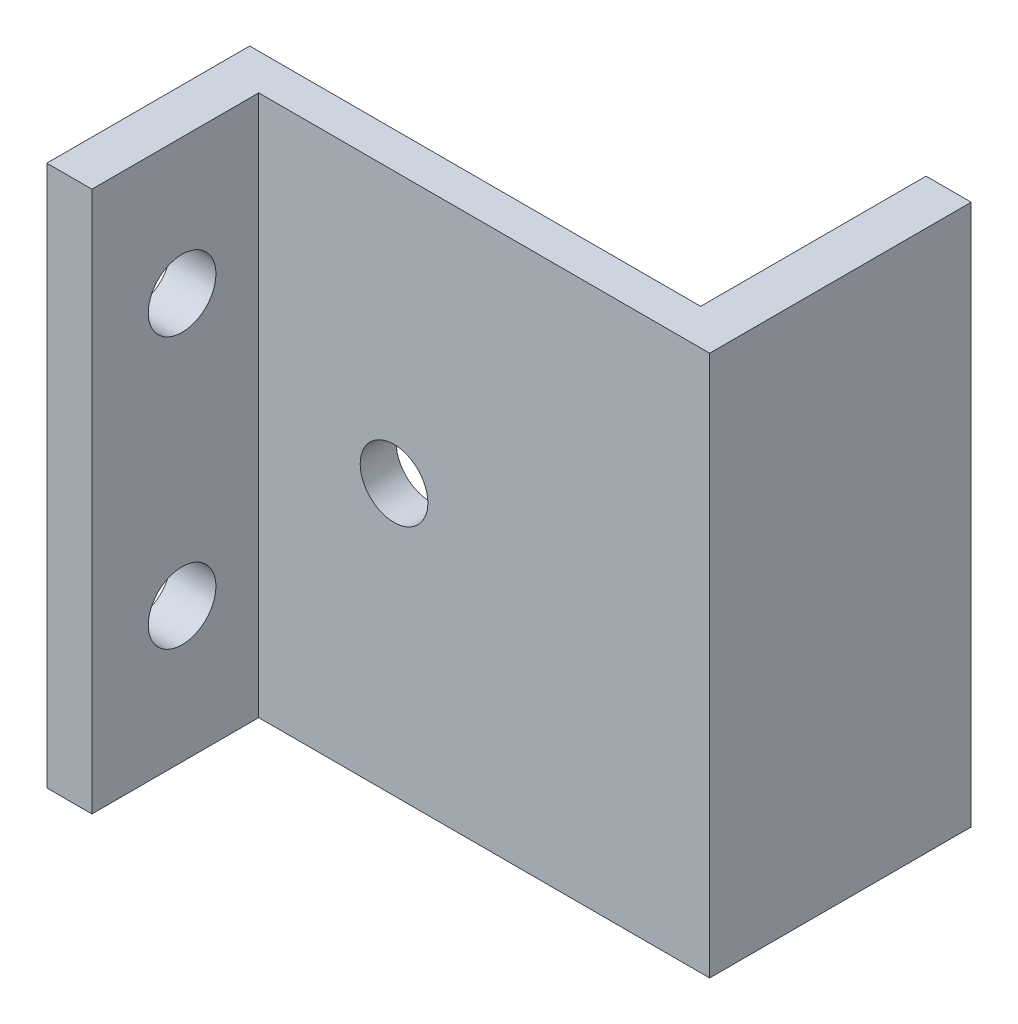
ISO-10303-21;
HEADER;
FILE_DESCRIPTION(('STEP AP214'),'2;1');
FILE_NAME('part.step','',(''),(''),'','','');
FILE_SCHEMA(('AUTOMOTIVE_DESIGN { 1 0 10303 214 1 1 1 1 }'));
ENDSEC;
DATA;
#1=APPLICATION_CONTEXT('core data for automotive mechanical design processes');
#2=APPLICATION_PROTOCOL_DEFINITION('international standard','automotive_design',2000,#1);
#3=PRODUCT_CONTEXT('',#1,'mechanical');
#4=PRODUCT('Part','Part','',(#3));
#5=PRODUCT_RELATED_PRODUCT_CATEGORY('part','',(#4));
#6=PRODUCT_DEFINITION_FORMATION('','',#4);
#7=PRODUCT_DEFINITION_CONTEXT('part definition',#1,'design');
#8=PRODUCT_DEFINITION('design','',#6,#7);
#9=PRODUCT_DEFINITION_SHAPE('','',#8);
#10=(LENGTH_UNIT() NAMED_UNIT(*) SI_UNIT(.MILLI.,.METRE.));
#11=(NAMED_UNIT(*) PLANE_ANGLE_UNIT() SI_UNIT($,.RADIAN.));
#12=(NAMED_UNIT(*) SI_UNIT($,.STERADIAN.) SOLID_ANGLE_UNIT());
#13=UNCERTAINTY_MEASURE_WITH_UNIT(LENGTH_MEASURE(1.E-05),#10,'distance_accuracy_value','');
#14=(GEOMETRIC_REPRESENTATION_CONTEXT(3) GLOBAL_UNCERTAINTY_ASSIGNED_CONTEXT((#13)) GLOBAL_UNIT_ASSIGNED_CONTEXT((#10,
#11,#12)) REPRESENTATION_CONTEXT('',''));
#15=CARTESIAN_POINT('',(0.,0.,0.));
#16=DIRECTION('',(0.,0.,1.));
#17=DIRECTION('',(1.,0.,0.));
#18=AXIS2_PLACEMENT_3D('',#15,#16,#17);
#19=CARTESIAN_POINT('',(0.,24.,0.));
#20=DIRECTION('',(1.,0.,0.));
#21=DIRECTION('',(0.,0.,-1.));
#22=AXIS2_PLACEMENT_3D('',#19,#20,#21);
#23=PLANE('',#22);
#24=CARTESIAN_POINT('',(0.,6.,3.4));
#25=DIRECTION('',(-1.,0.,0.));
#26=DIRECTION('',(0.,0.,1.));
#27=AXIS2_PLACEMENT_3D('',#24,#25,#26);
#28=CIRCLE('',#27,1.5);
#29=CARTESIAN_POINT('',(0.,6.,4.9));
#30=VERTEX_POINT('',#29);
#31=EDGE_CURVE('E165',#30,#30,#28,.T.);
#32=ORIENTED_EDGE('',*,*,#31,.F.);
#33=EDGE_LOOP('',(#32));
#34=FACE_BOUND('',#33,.T.);
#35=CARTESIAN_POINT('',(0.,18.,3.4));
#36=DIRECTION('',(-1.,0.,0.));
#37=DIRECTION('',(0.,0.,1.));
#38=AXIS2_PLACEMENT_3D('',#35,#36,#37);
#39=CIRCLE('',#38,1.5);
#40=CARTESIAN_POINT('',(0.,18.,4.9));
#41=VERTEX_POINT('',#40);
#42=EDGE_CURVE('E157',#41,#41,#39,.T.);
#43=ORIENTED_EDGE('',*,*,#42,.F.);
#44=EDGE_LOOP('',(#43));
#45=FACE_BOUND('',#44,.T.);
#46=DIRECTION('',(0.,0.,1.));
#47=VECTOR('',#46,1.);
#48=CARTESIAN_POINT('',(0.,0.,0.));
#49=LINE('',#48,#47);
#50=CARTESIAN_POINT('',(0.,0.,-1.6));
#51=VERTEX_POINT('',#50);
#52=CARTESIAN_POINT('',(0.,0.,7.4));
#53=VERTEX_POINT('',#52);
#54=EDGE_CURVE('E87',#51,#53,#49,.T.);
#55=ORIENTED_EDGE('',*,*,#54,.T.);
#56=DIRECTION('',(0.,-1.,0.));
#57=VECTOR('',#56,1.);
#58=CARTESIAN_POINT('',(0.,24.,7.4));
#59=LINE('',#58,#57);
#60=CARTESIAN_POINT('',(0.,24.,7.4));
#61=VERTEX_POINT('',#60);
#62=EDGE_CURVE('E11',#61,#53,#59,.T.);
#63=ORIENTED_EDGE('',*,*,#62,.F.);
#64=DIRECTION('',(0.,0.,1.));
#65=VECTOR('',#64,1.);
#66=CARTESIAN_POINT('',(0.,24.,-1.6));
#67=LINE('',#66,#65);
#68=CARTESIAN_POINT('',(0.,24.,-1.6));
#69=VERTEX_POINT('',#68);
#70=EDGE_CURVE('E93',#69,#61,#67,.T.);
#71=ORIENTED_EDGE('',*,*,#70,.F.);
#72=DIRECTION('',(0.,-1.,0.));
#73=VECTOR('',#72,1.);
#74=CARTESIAN_POINT('',(0.,24.,-1.6));
#75=LINE('',#74,#73);
#76=EDGE_CURVE('E127',#69,#51,#75,.T.);
#77=ORIENTED_EDGE('',*,*,#76,.T.);
#78=EDGE_LOOP('',(#55,#63,#71,#77));
#79=FACE_BOUND('',#78,.T.);
#80=ADVANCED_FACE('F33',(#34,#45,#79),#23,.F.);
#81=CARTESIAN_POINT('',(0.,24.,7.4));
#82=DIRECTION('',(0.,0.,-1.));
#83=DIRECTION('',(-1.,0.,0.));
#84=AXIS2_PLACEMENT_3D('',#81,#82,#83);
#85=PLANE('',#84);
#86=DIRECTION('',(1.,0.,0.));
#87=VECTOR('',#86,1.);
#88=CARTESIAN_POINT('',(0.,0.,7.4));
#89=LINE('',#88,#87);
#90=CARTESIAN_POINT('',(2.,0.,7.4));
#91=VERTEX_POINT('',#90);
#92=EDGE_CURVE('E132',#53,#91,#89,.T.);
#93=ORIENTED_EDGE('',*,*,#92,.T.);
#94=DIRECTION('',(0.,-1.,0.));
#95=VECTOR('',#94,1.);
#96=CARTESIAN_POINT('',(2.,24.,7.4));
#97=LINE('',#96,#95);
#98=CARTESIAN_POINT('',(2.,24.,7.4));
#99=VERTEX_POINT('',#98);
#100=EDGE_CURVE('E42',#99,#91,#97,.T.);
#101=ORIENTED_EDGE('',*,*,#100,.F.);
#102=DIRECTION('',(1.,0.,0.));
#103=VECTOR('',#102,1.);
#104=CARTESIAN_POINT('',(0.,24.,7.4));
#105=LINE('',#104,#103);
#106=EDGE_CURVE('E170',#61,#99,#105,.T.);
#107=ORIENTED_EDGE('',*,*,#106,.F.);
#108=ORIENTED_EDGE('',*,*,#62,.T.);
#109=EDGE_LOOP('',(#93,#101,#107,#108));
#110=FACE_BOUND('',#109,.T.);
#111=ADVANCED_FACE('F192',(#110),#85,.F.);
#112=CARTESIAN_POINT('',(2.,24.,7.4));
#113=DIRECTION('',(-1.,0.,0.));
#114=DIRECTION('',(0.,0.,1.));
#115=AXIS2_PLACEMENT_3D('',#112,#113,#114);
#116=PLANE('',#115);
#117=CARTESIAN_POINT('',(2.,6.,3.4));
#118=DIRECTION('',(-1.,0.,0.));
#119=DIRECTION('',(0.,0.,1.));
#120=AXIS2_PLACEMENT_3D('',#117,#118,#119);
#121=CIRCLE('',#120,1.5);
#122=CARTESIAN_POINT('',(2.,6.,4.9));
#123=VERTEX_POINT('',#122);
#124=EDGE_CURVE('E36',#123,#123,#121,.T.);
#125=ORIENTED_EDGE('',*,*,#124,.T.);
#126=EDGE_LOOP('',(#125));
#127=FACE_BOUND('',#126,.T.);
#128=CARTESIAN_POINT('',(2.,18.,3.4));
#129=DIRECTION('',(-1.,0.,0.));
#130=DIRECTION('',(0.,0.,1.));
#131=AXIS2_PLACEMENT_3D('',#128,#129,#130);
#132=CIRCLE('',#131,1.5);
#133=CARTESIAN_POINT('',(2.,18.,4.9));
#134=VERTEX_POINT('',#133);
#135=EDGE_CURVE('E133',#134,#134,#132,.T.);
#136=ORIENTED_EDGE('',*,*,#135,.T.);
#137=EDGE_LOOP('',(#136));
#138=FACE_BOUND('',#137,.T.);
#139=DIRECTION('',(0.,0.,-1.));
#140=VECTOR('',#139,1.);
#141=CARTESIAN_POINT('',(2.,0.,7.4));
#142=LINE('',#141,#140);
#143=CARTESIAN_POINT('',(2.,0.,0.));
#144=VERTEX_POINT('',#143);
#145=EDGE_CURVE('E135',#91,#144,#142,.T.);
#146=ORIENTED_EDGE('',*,*,#145,.T.);
#147=DIRECTION('',(0.,-1.,0.));
#148=VECTOR('',#147,1.);
#149=CARTESIAN_POINT('',(2.,24.,0.));
#150=LINE('',#149,#148);
#151=CARTESIAN_POINT('',(2.,24.,0.));
#152=VERTEX_POINT('',#151);
#153=EDGE_CURVE('E152',#152,#144,#150,.T.);
#154=ORIENTED_EDGE('',*,*,#153,.F.);
#155=DIRECTION('',(0.,0.,-1.));
#156=VECTOR('',#155,1.);
#157=CARTESIAN_POINT('',(2.,24.,7.4));
#158=LINE('',#157,#156);
#159=EDGE_CURVE('E172',#99,#152,#158,.T.);
#160=ORIENTED_EDGE('',*,*,#159,.F.);
#161=ORIENTED_EDGE('',*,*,#100,.T.);
#162=EDGE_LOOP('',(#146,#154,#160,#161));
#163=FACE_BOUND('',#162,.T.);
#164=ADVANCED_FACE('F195',(#127,#138,#163),#116,.F.);
#165=CARTESIAN_POINT('',(2.,24.,0.));
#166=DIRECTION('',(0.,0.,-1.));
#167=DIRECTION('',(-1.,0.,0.));
#168=AXIS2_PLACEMENT_3D('',#165,#166,#167);
#169=PLANE('',#168);
#170=CARTESIAN_POINT('',(8.,12.,0.));
#171=DIRECTION('',(0.,0.,-1.));
#172=DIRECTION('',(-1.,0.,0.));
#173=AXIS2_PLACEMENT_3D('',#170,#171,#172);
#174=CIRCLE('',#173,1.5);
#175=CARTESIAN_POINT('',(6.5,12.,0.));
#176=VERTEX_POINT('',#175);
#177=EDGE_CURVE('E213',#176,#176,#174,.T.);
#178=ORIENTED_EDGE('',*,*,#177,.T.);
#179=EDGE_LOOP('',(#178));
#180=FACE_BOUND('',#179,.T.);
#181=DIRECTION('',(1.,0.,0.));
#182=VECTOR('',#181,1.);
#183=CARTESIAN_POINT('',(2.,0.,0.));
#184=LINE('',#183,#182);
#185=CARTESIAN_POINT('',(22.,0.,0.));
#186=VERTEX_POINT('',#185);
#187=EDGE_CURVE('E137',#144,#186,#184,.T.);
#188=ORIENTED_EDGE('',*,*,#187,.T.);
#189=DIRECTION('',(0.,-1.,0.));
#190=VECTOR('',#189,1.);
#191=CARTESIAN_POINT('',(22.,24.,0.));
#192=LINE('',#191,#190);
#193=CARTESIAN_POINT('',(22.,24.,0.));
#194=VERTEX_POINT('',#193);
#195=EDGE_CURVE('E149',#194,#186,#192,.T.);
#196=ORIENTED_EDGE('',*,*,#195,.F.);
#197=DIRECTION('',(1.,0.,0.));
#198=VECTOR('',#197,1.);
#199=CARTESIAN_POINT('',(2.,24.,0.));
#200=LINE('',#199,#198);
#201=EDGE_CURVE('E174',#152,#194,#200,.T.);
#202=ORIENTED_EDGE('',*,*,#201,.F.);
#203=ORIENTED_EDGE('',*,*,#153,.T.);
#204=EDGE_LOOP('',(#188,#196,#202,#203));
#205=FACE_BOUND('',#204,.T.);
#206=ADVANCED_FACE('F180',(#180,#205),#169,.F.);
#207=CARTESIAN_POINT('',(22.,24.,0.));
#208=DIRECTION('',(-1.,0.,0.));
#209=DIRECTION('',(0.,0.,1.));
#210=AXIS2_PLACEMENT_3D('',#207,#208,#209);
#211=PLANE('',#210);
#212=DIRECTION('',(0.,0.,-1.));
#213=VECTOR('',#212,1.);
#214=CARTESIAN_POINT('',(22.,0.,0.));
#215=LINE('',#214,#213);
#216=CARTESIAN_POINT('',(22.,0.,-11.6));
#217=VERTEX_POINT('',#216);
#218=EDGE_CURVE('E139',#186,#217,#215,.T.);
#219=ORIENTED_EDGE('',*,*,#218,.T.);
#220=DIRECTION('',(0.,-1.,0.));
#221=VECTOR('',#220,1.);
#222=CARTESIAN_POINT('',(22.,24.,-11.6));
#223=LINE('',#222,#221);
#224=CARTESIAN_POINT('',(22.,24.,-11.6));
#225=VERTEX_POINT('',#224);
#226=EDGE_CURVE('E122',#225,#217,#223,.T.);
#227=ORIENTED_EDGE('',*,*,#226,.F.);
#228=DIRECTION('',(0.,0.,-1.));
#229=VECTOR('',#228,1.);
#230=CARTESIAN_POINT('',(22.,24.,0.));
#231=LINE('',#230,#229);
#232=EDGE_CURVE('E113',#194,#225,#231,.T.);
#233=ORIENTED_EDGE('',*,*,#232,.F.);
#234=ORIENTED_EDGE('',*,*,#195,.T.);
#235=EDGE_LOOP('',(#219,#227,#233,#234));
#236=FACE_BOUND('',#235,.T.);
#237=ADVANCED_FACE('F184',(#236),#211,.F.);
#238=CARTESIAN_POINT('',(22.,24.,-11.6));
#239=DIRECTION('',(0.,0.,1.));
#240=DIRECTION('',(1.,0.,0.));
#241=AXIS2_PLACEMENT_3D('',#238,#239,#240);
#242=PLANE('',#241);
#243=DIRECTION('',(-1.,0.,0.));
#244=VECTOR('',#243,1.);
#245=CARTESIAN_POINT('',(22.,0.,-11.6));
#246=LINE('',#245,#244);
#247=CARTESIAN_POINT('',(20.,0.,-11.6));
#248=VERTEX_POINT('',#247);
#249=EDGE_CURVE('E121',#217,#248,#246,.T.);
#250=ORIENTED_EDGE('',*,*,#249,.T.);
#251=DIRECTION('',(0.,-1.,0.));
#252=VECTOR('',#251,1.);
#253=CARTESIAN_POINT('',(20.,24.,-11.6));
#254=LINE('',#253,#252);
#255=CARTESIAN_POINT('',(20.,24.,-11.6));
#256=VERTEX_POINT('',#255);
#257=EDGE_CURVE('E118',#256,#248,#254,.T.);
#258=ORIENTED_EDGE('',*,*,#257,.F.);
#259=DIRECTION('',(-1.,0.,0.));
#260=VECTOR('',#259,1.);
#261=CARTESIAN_POINT('',(22.,24.,-11.6));
#262=LINE('',#261,#260);
#263=EDGE_CURVE('E107',#225,#256,#262,.T.);
#264=ORIENTED_EDGE('',*,*,#263,.F.);
#265=ORIENTED_EDGE('',*,*,#226,.T.);
#266=EDGE_LOOP('',(#250,#258,#264,#265));
#267=FACE_BOUND('',#266,.T.);
#268=ADVANCED_FACE('F119',(#267),#242,.F.);
#269=CARTESIAN_POINT('',(20.,24.,-11.6));
#270=DIRECTION('',(1.,0.,0.));
#271=DIRECTION('',(0.,0.,-1.));
#272=AXIS2_PLACEMENT_3D('',#269,#270,#271);
#273=PLANE('',#272);
#274=DIRECTION('',(0.,0.,1.));
#275=VECTOR('',#274,1.);
#276=CARTESIAN_POINT('',(20.,0.,-11.6));
#277=LINE('',#276,#275);
#278=CARTESIAN_POINT('',(20.,0.,-1.6));
#279=VERTEX_POINT('',#278);
#280=EDGE_CURVE('E80',#248,#279,#277,.T.);
#281=ORIENTED_EDGE('',*,*,#280,.T.);
#282=DIRECTION('',(0.,-1.,0.));
#283=VECTOR('',#282,1.);
#284=CARTESIAN_POINT('',(20.,24.,-1.6));
#285=LINE('',#284,#283);
#286=CARTESIAN_POINT('',(20.,24.,-1.6));
#287=VERTEX_POINT('',#286);
#288=EDGE_CURVE('E123',#287,#279,#285,.T.);
#289=ORIENTED_EDGE('',*,*,#288,.F.);
#290=DIRECTION('',(0.,0.,1.));
#291=VECTOR('',#290,1.);
#292=CARTESIAN_POINT('',(20.,24.,-11.6));
#293=LINE('',#292,#291);
#294=EDGE_CURVE('E111',#256,#287,#293,.T.);
#295=ORIENTED_EDGE('',*,*,#294,.F.);
#296=ORIENTED_EDGE('',*,*,#257,.T.);
#297=EDGE_LOOP('',(#281,#289,#295,#296));
#298=FACE_BOUND('',#297,.T.);
#299=ADVANCED_FACE('F125',(#298),#273,.F.);
#300=CARTESIAN_POINT('',(20.,24.,-1.6));
#301=DIRECTION('',(0.,0.,1.));
#302=DIRECTION('',(1.,0.,0.));
#303=AXIS2_PLACEMENT_3D('',#300,#301,#302);
#304=PLANE('',#303);
#305=CARTESIAN_POINT('',(8.,12.,-1.6));
#306=DIRECTION('',(0.,0.,-1.));
#307=DIRECTION('',(-1.,0.,0.));
#308=AXIS2_PLACEMENT_3D('',#305,#306,#307);
#309=CIRCLE('',#308,1.5);
#310=CARTESIAN_POINT('',(6.5,12.,-1.6));
#311=VERTEX_POINT('',#310);
#312=EDGE_CURVE('E215',#311,#311,#309,.T.);
#313=ORIENTED_EDGE('',*,*,#312,.F.);
#314=EDGE_LOOP('',(#313));
#315=FACE_BOUND('',#314,.T.);
#316=DIRECTION('',(-1.,0.,0.));
#317=VECTOR('',#316,1.);
#318=CARTESIAN_POINT('',(20.,0.,-1.6));
#319=LINE('',#318,#317);
#320=EDGE_CURVE('E143',#279,#51,#319,.T.);
#321=ORIENTED_EDGE('',*,*,#320,.T.);
#322=ORIENTED_EDGE('',*,*,#76,.F.);
#323=DIRECTION('',(-1.,0.,0.));
#324=VECTOR('',#323,1.);
#325=CARTESIAN_POINT('',(20.,24.,-1.6));
#326=LINE('',#325,#324);
#327=EDGE_CURVE('E51',#287,#69,#326,.T.);
#328=ORIENTED_EDGE('',*,*,#327,.F.);
#329=ORIENTED_EDGE('',*,*,#288,.T.);
#330=EDGE_LOOP('',(#321,#322,#328,#329));
#331=FACE_BOUND('',#330,.T.);
#332=ADVANCED_FACE('F187',(#315,#331),#304,.F.);
#333=CARTESIAN_POINT('',(0.,24.,0.));
#334=DIRECTION('',(0.,1.,0.));
#335=DIRECTION('',(0.,0.,1.));
#336=AXIS2_PLACEMENT_3D('',#333,#334,#335);
#337=PLANE('',#336);
#338=ORIENTED_EDGE('',*,*,#70,.T.);
#339=ORIENTED_EDGE('',*,*,#106,.T.);
#340=ORIENTED_EDGE('',*,*,#159,.T.);
#341=ORIENTED_EDGE('',*,*,#201,.T.);
#342=ORIENTED_EDGE('',*,*,#232,.T.);
#343=ORIENTED_EDGE('',*,*,#263,.T.);
#344=ORIENTED_EDGE('',*,*,#294,.T.);
#345=ORIENTED_EDGE('',*,*,#327,.T.);
#346=EDGE_LOOP('',(#338,#339,#340,#341,#342,#343,#344,#345));
#347=FACE_BOUND('',#346,.T.);
#348=ADVANCED_FACE('F109',(#347),#337,.T.);
#349=CARTESIAN_POINT('',(0.,0.,0.));
#350=DIRECTION('',(0.,1.,0.));
#351=DIRECTION('',(0.,0.,1.));
#352=AXIS2_PLACEMENT_3D('',#349,#350,#351);
#353=PLANE('',#352);
#354=ORIENTED_EDGE('',*,*,#54,.F.);
#355=ORIENTED_EDGE('',*,*,#320,.F.);
#356=ORIENTED_EDGE('',*,*,#280,.F.);
#357=ORIENTED_EDGE('',*,*,#249,.F.);
#358=ORIENTED_EDGE('',*,*,#218,.F.);
#359=ORIENTED_EDGE('',*,*,#187,.F.);
#360=ORIENTED_EDGE('',*,*,#145,.F.);
#361=ORIENTED_EDGE('',*,*,#92,.F.);
#362=EDGE_LOOP('',(#354,#355,#356,#357,#358,#359,#360,#361));
#363=FACE_BOUND('',#362,.T.);
#364=ADVANCED_FACE('F185',(#363),#353,.F.);
#365=CARTESIAN_POINT('',(24.,18.,3.4));
#366=DIRECTION('',(-1.,0.,0.));
#367=DIRECTION('',(0.,0.,1.));
#368=AXIS2_PLACEMENT_3D('',#365,#366,#367);
#369=CYLINDRICAL_SURFACE('',#368,1.5);
#370=ORIENTED_EDGE('',*,*,#42,.T.);
#371=EDGE_LOOP('',(#370));
#372=FACE_BOUND('',#371,.T.);
#373=ORIENTED_EDGE('',*,*,#135,.F.);
#374=EDGE_LOOP('',(#373));
#375=FACE_BOUND('',#374,.T.);
#376=ADVANCED_FACE('F265',(#372,#375),#369,.F.);
#377=CARTESIAN_POINT('',(24.,6.,3.4));
#378=DIRECTION('',(-1.,0.,0.));
#379=DIRECTION('',(0.,0.,1.));
#380=AXIS2_PLACEMENT_3D('',#377,#378,#379);
#381=CYLINDRICAL_SURFACE('',#380,1.5);
#382=ORIENTED_EDGE('',*,*,#31,.T.);
#383=EDGE_LOOP('',(#382));
#384=FACE_BOUND('',#383,.T.);
#385=ORIENTED_EDGE('',*,*,#124,.F.);
#386=EDGE_LOOP('',(#385));
#387=FACE_BOUND('',#386,.T.);
#388=ADVANCED_FACE('F285',(#384,#387),#381,.F.);
#389=CARTESIAN_POINT('',(8.,12.,11.4));
#390=DIRECTION('',(0.,0.,-1.));
#391=DIRECTION('',(-1.,0.,0.));
#392=AXIS2_PLACEMENT_3D('',#389,#390,#391);
#393=CYLINDRICAL_SURFACE('',#392,1.5);
#394=CARTESIAN_POINT('',(6.5,12.,-1.6));
#395=CARTESIAN_POINT('',(6.5,12.,-1.58333333333333));
#396=CARTESIAN_POINT('',(6.5,12.,-1.56666666666666));
#397=CARTESIAN_POINT('',(6.5,12.,-1.53333333333333));
#398=CARTESIAN_POINT('',(6.5,12.,-1.51666666666666));
#399=CARTESIAN_POINT('',(6.5,12.,-1.48333333333333));
#400=CARTESIAN_POINT('',(6.5,12.,-1.46666666666666));
#401=CARTESIAN_POINT('',(6.5,12.,-1.43333333333333));
#402=CARTESIAN_POINT('',(6.5,12.,-1.41666666666666));
#403=CARTESIAN_POINT('',(6.5,12.,-1.38333333333333));
#404=CARTESIAN_POINT('',(6.5,12.,-1.36666666666666));
#405=CARTESIAN_POINT('',(6.5,12.,-1.33333333333333));
#406=CARTESIAN_POINT('',(6.5,12.,-1.31666666666666));
#407=CARTESIAN_POINT('',(6.5,12.,-1.28333333333333));
#408=CARTESIAN_POINT('',(6.5,12.,-1.26666666666666));
#409=CARTESIAN_POINT('',(6.5,12.,-1.23333333333333));
#410=CARTESIAN_POINT('',(6.5,12.,-1.21666666666666));
#411=CARTESIAN_POINT('',(6.5,12.,-1.18333333333333));
#412=CARTESIAN_POINT('',(6.5,12.,-1.16666666666666));
#413=CARTESIAN_POINT('',(6.5,12.,-1.13333333333333));
#414=CARTESIAN_POINT('',(6.5,12.,-1.11666666666667));
#415=CARTESIAN_POINT('',(6.5,12.,-1.08333333333333));
#416=CARTESIAN_POINT('',(6.5,12.,-1.06666666666667));
#417=CARTESIAN_POINT('',(6.5,12.,-1.03333333333333));
#418=CARTESIAN_POINT('',(6.5,12.,-1.01666666666666));
#419=CARTESIAN_POINT('',(6.5,12.,-0.983333333333331));
#420=CARTESIAN_POINT('',(6.5,12.,-0.966666666666664));
#421=CARTESIAN_POINT('',(6.5,12.,-0.933333333333331));
#422=CARTESIAN_POINT('',(6.5,12.,-0.916666666666665));
#423=CARTESIAN_POINT('',(6.5,12.,-0.883333333333331));
#424=CARTESIAN_POINT('',(6.5,12.,-0.866666666666665));
#425=CARTESIAN_POINT('',(6.5,12.,-0.833333333333332));
#426=CARTESIAN_POINT('',(6.5,12.,-0.816666666666665));
#427=CARTESIAN_POINT('',(6.5,12.,-0.783333333333332));
#428=CARTESIAN_POINT('',(6.5,12.,-0.766666666666665));
#429=CARTESIAN_POINT('',(6.5,12.,-0.733333333333332));
#430=CARTESIAN_POINT('',(6.5,12.,-0.716666666666666));
#431=CARTESIAN_POINT('',(6.5,12.,-0.683333333333333));
#432=CARTESIAN_POINT('',(6.5,12.,-0.666666666666666));
#433=CARTESIAN_POINT('',(6.5,12.,-0.633333333333333));
#434=CARTESIAN_POINT('',(6.5,12.,-0.616666666666666));
#435=CARTESIAN_POINT('',(6.5,12.,-0.583333333333333));
#436=CARTESIAN_POINT('',(6.5,12.,-0.566666666666666));
#437=CARTESIAN_POINT('',(6.5,12.,-0.533333333333332));
#438=CARTESIAN_POINT('',(6.5,12.,-0.516666666666665));
#439=CARTESIAN_POINT('',(6.5,12.,-0.483333333333332));
#440=CARTESIAN_POINT('',(6.5,12.,-0.466666666666666));
#441=CARTESIAN_POINT('',(6.5,12.,-0.433333333333332));
#442=CARTESIAN_POINT('',(6.5,12.,-0.416666666666666));
#443=CARTESIAN_POINT('',(6.5,12.,-0.383333333333333));
#444=CARTESIAN_POINT('',(6.5,12.,-0.366666666666666));
#445=CARTESIAN_POINT('',(6.5,12.,-0.333333333333333));
#446=CARTESIAN_POINT('',(6.5,12.,-0.316666666666666));
#447=CARTESIAN_POINT('',(6.5,12.,-0.283333333333333));
#448=CARTESIAN_POINT('',(6.5,12.,-0.266666666666667));
#449=CARTESIAN_POINT('',(6.5,12.,-0.233333333333333));
#450=CARTESIAN_POINT('',(6.5,12.,-0.216666666666666));
#451=CARTESIAN_POINT('',(6.5,12.,-0.183333333333332));
#452=CARTESIAN_POINT('',(6.5,12.,-0.166666666666666));
#453=CARTESIAN_POINT('',(6.5,12.,-0.133333333333333));
#454=CARTESIAN_POINT('',(6.5,12.,-0.116666666666666));
#455=CARTESIAN_POINT('',(6.5,12.,-0.0833333333333328));
#456=CARTESIAN_POINT('',(6.5,12.,-0.0666666666666663));
#457=CARTESIAN_POINT('',(6.5,12.,-0.0333333333333331));
#458=CARTESIAN_POINT('',(6.5,12.,-0.0166666666666666));
#459=CARTESIAN_POINT('',(6.5,12.,0.));
#460=B_SPLINE_CURVE_WITH_KNOTS('',3,(#394,#395,#396,#397,#398,#399,#400,#401,#402,#403,#404,
#405,#406,#407,#408,#409,#410,#411,#412,#413,#414,#415,#416,#417,#418,#419,#420,#421,#422,#423,
#424,#425,#426,#427,#428,#429,#430,#431,#432,#433,#434,#435,#436,#437,#438,#439,#440,#441,#442,
#443,#444,#445,#446,#447,#448,#449,#450,#451,#452,#453,#454,#455,#456,#457,#458,#459),
.UNSPECIFIED.,.F.,.F.,(4,2,2,2,2,2,2,2,2,2,2,2,2,2,2,2,2,2,2,2,2,2,2,2,2,2,2,2,2,2,2,2,4),(0.,
0.0499999999999997,0.0999999999999994,0.149999999999999,0.199999999999999,0.25,0.3,0.35,
0.399999999999999,0.449999999999999,0.499999999999999,0.549999999999998,0.6,0.65,
0.699999999999999,0.749999999999999,0.799999999999999,0.849999999999998,0.899999999999998,
0.949999999999998,0.999999999999997,1.05,1.1,1.15,1.2,1.25,1.3,1.35,1.4,1.45,1.5,1.55,1.6),.UNSPECIFIED.);
#461=EDGE_CURVE('BSEAM221',#311,#176,#460,.T.);
#462=ORIENTED_EDGE('',*,*,#312,.T.);
#463=ORIENTED_EDGE('',*,*,#177,.F.);
#464=ORIENTED_EDGE('',*,*,#461,.T.);
#465=ORIENTED_EDGE('',*,*,#461,.F.);
#466=EDGE_LOOP('',(#462,#464,#463,#465));
#467=FACE_BOUND('',#466,.T.);
#468=ADVANCED_FACE('F221',(#467),#393,.F.);
#469=CLOSED_SHELL('',(#80,#111,#164,#206,#237,#268,#299,#332,#348,#364,#376,#388,#468));
#470=MANIFOLD_SOLID_BREP('B2',#469);
#471=ADVANCED_BREP_SHAPE_REPRESENTATION('',(#18,#470),#14);
#472=SHAPE_DEFINITION_REPRESENTATION(#9,#471);
ENDSEC;
END-ISO-10303-21;
